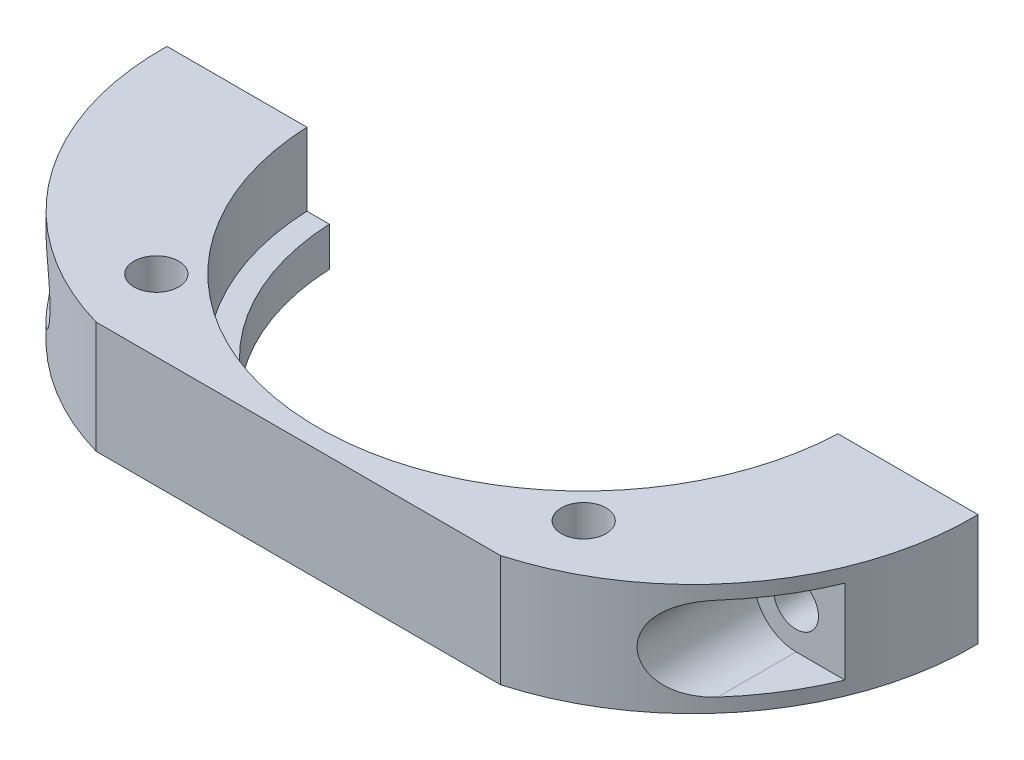
ISO-10303-21;
HEADER;
FILE_DESCRIPTION(('STEP AP214'),'2;1');
FILE_NAME('part.step','',(''),(''),'','','');
FILE_SCHEMA(('AUTOMOTIVE_DESIGN { 1 0 10303 214 1 1 1 1 }'));
ENDSEC;
DATA;
#1=APPLICATION_CONTEXT('core data for automotive mechanical design processes');
#2=APPLICATION_PROTOCOL_DEFINITION('international standard','automotive_design',2000,#1);
#3=PRODUCT_CONTEXT('',#1,'mechanical');
#4=PRODUCT('Part','Part','',(#3));
#5=PRODUCT_RELATED_PRODUCT_CATEGORY('part','',(#4));
#6=PRODUCT_DEFINITION_FORMATION('','',#4);
#7=PRODUCT_DEFINITION_CONTEXT('part definition',#1,'design');
#8=PRODUCT_DEFINITION('design','',#6,#7);
#9=PRODUCT_DEFINITION_SHAPE('','',#8);
#10=(LENGTH_UNIT() NAMED_UNIT(*) SI_UNIT(.MILLI.,.METRE.));
#11=(NAMED_UNIT(*) PLANE_ANGLE_UNIT() SI_UNIT($,.RADIAN.));
#12=(NAMED_UNIT(*) SI_UNIT($,.STERADIAN.) SOLID_ANGLE_UNIT());
#13=UNCERTAINTY_MEASURE_WITH_UNIT(LENGTH_MEASURE(1.E-05),#10,'distance_accuracy_value','');
#14=(GEOMETRIC_REPRESENTATION_CONTEXT(3) GLOBAL_UNCERTAINTY_ASSIGNED_CONTEXT((#13)) GLOBAL_UNIT_ASSIGNED_CONTEXT((#10,
#11,#12)) REPRESENTATION_CONTEXT('',''));
#15=CARTESIAN_POINT('',(0.,0.,0.));
#16=DIRECTION('',(0.,0.,1.));
#17=DIRECTION('',(1.,0.,0.));
#18=AXIS2_PLACEMENT_3D('',#15,#16,#17);
#19=CARTESIAN_POINT('',(22.4760908283651,0.,2.89990936322075));
#20=DIRECTION('',(0.,1.,0.));
#21=DIRECTION('',(0.,0.,1.));
#22=AXIS2_PLACEMENT_3D('',#19,#20,#21);
#23=CYLINDRICAL_SURFACE('',#22,50.);
#24=CARTESIAN_POINT('',(22.4760908283651,20.,2.89990936322075));
#25=DIRECTION('',(0.,1.,0.));
#26=DIRECTION('',(0.,0.,1.));
#27=AXIS2_PLACEMENT_3D('',#24,#25,#26);
#28=CIRCLE('',#27,50.);
#29=CARTESIAN_POINT('',(36.1282437990003,20.,51.));
#30=VERTEX_POINT('',#29);
#31=CARTESIAN_POINT('',(72.467991803803,20.,1.99999999999999));
#32=VERTEX_POINT('',#31);
#33=EDGE_CURVE('E191',#30,#32,#28,.T.);
#34=ORIENTED_EDGE('',*,*,#33,.F.);
#35=DIRECTION('',(0.,1.,0.));
#36=VECTOR('',#35,1.);
#37=CARTESIAN_POINT('',(36.1282437990003,0.,51.));
#38=LINE('',#37,#36);
#39=CARTESIAN_POINT('',(36.1282437990003,0.,51.));
#40=VERTEX_POINT('',#39);
#41=EDGE_CURVE('E220',#40,#30,#38,.T.);
#42=ORIENTED_EDGE('',*,*,#41,.F.);
#43=CARTESIAN_POINT('',(22.4760908283651,0.,2.89990936322075));
#44=DIRECTION('',(0.,1.,0.));
#45=DIRECTION('',(0.,0.,1.));
#46=AXIS2_PLACEMENT_3D('',#43,#44,#45);
#47=CIRCLE('',#46,50.);
#48=CARTESIAN_POINT('',(72.467991803803,0.,1.99999999999999));
#49=VERTEX_POINT('',#48);
#50=EDGE_CURVE('E192',#40,#49,#47,.T.);
#51=ORIENTED_EDGE('',*,*,#50,.T.);
#52=DIRECTION('',(0.,1.,0.));
#53=VECTOR('',#52,1.);
#54=CARTESIAN_POINT('',(72.467991803803,0.,1.99999999999999));
#55=LINE('',#54,#53);
#56=EDGE_CURVE('E195',#49,#32,#55,.T.);
#57=ORIENTED_EDGE('',*,*,#56,.T.);
#58=EDGE_LOOP('',(#34,#42,#51,#57));
#59=FACE_BOUND('',#58,.T.);
#60=CARTESIAN_POINT('',(59.9629339312361,2.5,35.9867132913843));
#61=CARTESIAN_POINT('',(59.8321473534697,2.50000490254947,36.1348939411293));
#62=CARTESIAN_POINT('',(59.7004895048435,2.50342124204607,36.2822872340539));
#63=CARTESIAN_POINT('',(59.4355872395805,2.51738552209846,36.5753402070957));
#64=CARTESIAN_POINT('',(59.3023425709022,2.52793461083026,36.7209996042615));
#65=CARTESIAN_POINT('',(58.899885127785,2.57081094263651,37.1557596064065));
#66=CARTESIAN_POINT('',(58.6285765048718,2.61437026344922,37.4419310998493));
#67=CARTESIAN_POINT('',(58.0796973690396,2.73479019147125,38.00746228713));
#68=CARTESIAN_POINT('',(57.8020907417195,2.81202116393458,38.2867086213446));
#69=CARTESIAN_POINT('',(57.2470365893541,3.00286684903563,38.8322394316276));
#70=CARTESIAN_POINT('',(56.9695892700129,3.11643801618865,39.0985389837632));
#71=CARTESIAN_POINT('',(56.5189695744482,3.33463671248979,39.5214936845249));
#72=CARTESIAN_POINT('',(56.3444985051512,3.42755004567878,39.6828647604816));
#73=CARTESIAN_POINT('',(55.9987140296877,3.63014188382216,39.9982706653034));
#74=CARTESIAN_POINT('',(55.8273997577188,3.7398157128781,40.152307524621));
#75=CARTESIAN_POINT('',(55.4902010938871,3.97614017743429,40.4514625392735));
#76=CARTESIAN_POINT('',(55.3242983178517,4.10272374662969,40.5966127830976));
#77=CARTESIAN_POINT('',(54.9991493215393,4.37366892460497,40.8774920901841));
#78=CARTESIAN_POINT('',(54.8399019093066,4.51802733153071,41.0132228433502));
#79=CARTESIAN_POINT('',(54.5570235026142,4.79820980865781,41.2514650263187));
#80=CARTESIAN_POINT('',(54.431995476748,4.93119302066629,41.3556621762076));
#81=CARTESIAN_POINT('',(54.1893519559021,5.20940446918353,41.5560060249135));
#82=CARTESIAN_POINT('',(54.0717349613603,5.35463021452137,41.6521543536462));
#83=CARTESIAN_POINT('',(53.8452443331133,5.65723341596586,41.8357217472647));
#84=CARTESIAN_POINT('',(53.7363791925658,5.81462239213998,41.9231323522569));
#85=CARTESIAN_POINT('',(53.5291031290041,6.14083672774188,42.0882747755026));
#86=CARTESIAN_POINT('',(53.4306868597078,6.3096561655197,42.1660115470201));
#87=CARTESIAN_POINT('',(53.2450246747228,6.6594576969593,42.3116684910022));
#88=CARTESIAN_POINT('',(53.1578787088994,6.84052944376635,42.3795014348266));
#89=CARTESIAN_POINT('',(52.9972738663002,7.21242082745399,42.5037943949642));
#90=CARTESIAN_POINT('',(52.923815350952,7.40324072157237,42.5602541109618));
#91=CARTESIAN_POINT('',(52.7920670926956,7.79297801495934,42.6610520522234));
#92=CARTESIAN_POINT('',(52.7337651301242,7.99188874057879,42.7054000437868));
#93=CARTESIAN_POINT('',(52.6334760068504,8.39613287146042,42.781435115773));
#94=CARTESIAN_POINT('',(52.5914859769669,8.60146514033613,42.813124422818));
#95=CARTESIAN_POINT('',(52.5294636995233,8.98704608161373,42.8598399435531));
#96=CARTESIAN_POINT('',(52.5071629541487,9.16672561934126,42.8765911790697));
#97=CARTESIAN_POINT('',(52.4756158370107,9.52786677814178,42.9002705516381));
#98=CARTESIAN_POINT('',(52.4663683686512,9.70932824822612,42.907199513852));
#99=CARTESIAN_POINT('',(52.4610865284788,10.072477977827,42.9111583128527));
#100=CARTESIAN_POINT('',(52.4650470186662,10.2541661216773,42.9081919989795));
#101=CARTESIAN_POINT('',(52.4861019172273,10.6163469857034,42.8924012577202));
#102=CARTESIAN_POINT('',(52.5031960585452,10.7968397301107,42.8795770307819));
#103=CARTESIAN_POINT('',(52.5486337050359,11.1430414161387,42.845408587638));
#104=CARTESIAN_POINT('',(52.5761380065553,11.3089244866859,42.8246994031264));
#105=CARTESIAN_POINT('',(52.6419236384752,11.6373335251483,42.7750172508248));
#106=CARTESIAN_POINT('',(52.6802083679218,11.7998584168606,42.7460416766216));
#107=CARTESIAN_POINT('',(52.767005056981,12.1204178085625,42.6800989021646));
#108=CARTESIAN_POINT('',(52.8155130901551,12.2784540061462,42.643134769918));
#109=CARTESIAN_POINT('',(52.9221436225707,12.5892625404786,42.561507627507));
#110=CARTESIAN_POINT('',(52.9802697583256,12.7420328597493,42.5168417050989));
#111=CARTESIAN_POINT('',(53.107879911177,13.0474054165437,42.4182626034981));
#112=CARTESIAN_POINT('',(53.1777217955468,13.1997627955091,42.3640539133711));
#113=CARTESIAN_POINT('',(53.3261368588886,13.4972267405823,42.2481436553853));
#114=CARTESIAN_POINT('',(53.4047131875408,13.6423306635383,42.1864393838366));
#115=CARTESIAN_POINT('',(53.6521800421304,14.0658487983618,41.9907723308823));
#116=CARTESIAN_POINT('',(53.8328799312477,14.3326372486403,41.8462005997349));
#117=CARTESIAN_POINT('',(54.2428500461209,14.8638780945627,41.5127479477496));
#118=CARTESIAN_POINT('',(54.4753754343577,15.1236971540149,41.3205679571745));
#119=CARTESIAN_POINT('',(54.9615864708278,15.599308575329,40.910351221334));
#120=CARTESIAN_POINT('',(55.2152814304039,15.8150814183206,40.6923030801047));
#121=CARTESIAN_POINT('',(55.6748357611345,16.1582613655552,40.2885974641109));
#122=CARTESIAN_POINT('',(55.8780148509836,16.2945343008477,40.1072828090559));
#123=CARTESIAN_POINT('',(56.2892947720284,16.5430968685945,39.7339201051077));
#124=CARTESIAN_POINT('',(56.4973978062551,16.6553755314145,39.5418671973355));
#125=CARTESIAN_POINT('',(56.9166665989566,16.8574486146319,39.1480785126815));
#126=CARTESIAN_POINT('',(57.1278400314058,16.9471698789752,38.9463136965674));
#127=CARTESIAN_POINT('',(57.5506091481987,17.1050398109545,38.5350760041181));
#128=CARTESIAN_POINT('',(57.7622047383846,17.1731928430402,38.3256046968223));
#129=CARTESIAN_POINT('',(58.1427298284313,17.277895382665,37.94201027419));
#130=CARTESIAN_POINT('',(58.3118599633097,17.3180249867996,37.7690445564211));
#131=CARTESIAN_POINT('',(58.6487629873141,17.3859650367671,37.4194215298302));
#132=CARTESIAN_POINT('',(58.8165358998936,17.4137756959245,37.2427642849891));
#133=CARTESIAN_POINT('',(59.1487935136578,17.4575487478707,36.8877229525871));
#134=CARTESIAN_POINT('',(59.3132939342071,17.4736072311476,36.7093652311282));
#135=CARTESIAN_POINT('',(59.6399586776628,17.494826875342,36.3499620975961));
#136=CARTESIAN_POINT('',(59.8021235934731,17.4999908522164,36.1689173922275));
#137=CARTESIAN_POINT('',(59.9629339312361,17.5,35.9867132913843));
#138=B_SPLINE_CURVE_WITH_KNOTS('',3,(#60,#61,#62,#63,#64,#65,#66,#67,#68,#69,#70,#71,#72,#73,
#74,#75,#76,#77,#78,#79,#80,#81,#82,#83,#84,#85,#86,#87,#88,#89,#90,#91,#92,#93,#94,#95,#96,#97,
#98,#99,#100,#101,#102,#103,#104,#105,#106,#107,#108,#109,#110,#111,#112,#113,#114,#115,#116,
#117,#118,#119,#120,#121,#122,#123,#124,#125,#126,#127,#128,#129,#130,#131,#132,#133,#134,#135,
#136,#137),.UNSPECIFIED.,.F.,.F.,(4,2,2,2,2,2,2,2,2,2,2,2,2,2,2,2,2,2,2,2,2,2,2,2,2,2,2,2,2,2,2,
2,2,2,2,2,2,2,4),(0.,0.592861417796266,1.18581829266591,2.37456931277627,3.57673934488402,
4.77747420966356,5.54241456580662,6.30714190464041,7.06892161217391,7.83056429741832,
8.46050174486658,9.09031131752983,9.7207248849041,10.3508143236371,10.9861559400371,
11.6215143307411,12.2563588767809,12.8910917064714,13.4358706974822,13.9806039192932,
14.5251252603258,15.0696355295154,15.5773115874443,16.0851478941373,16.5927895117004,
17.1006235041632,17.6285111051843,18.1565896862099,19.212181270664,20.4023384207536,
21.5930218437949,22.5053797299361,23.4181538371748,24.3338510538087,25.2493628554512,
25.9846815708407,26.7199875523706,27.4492120771395,28.1782480925518),.UNSPECIFIED.);
#139=CARTESIAN_POINT('',(59.9629339312361,2.5,35.9867132913843));
#140=VERTEX_POINT('',#139);
#141=CARTESIAN_POINT('',(59.9629339312361,17.5,35.9867132913843));
#142=VERTEX_POINT('',#141);
#143=EDGE_CURVE('E46',#140,#142,#138,.T.);
#144=ORIENTED_EDGE('',*,*,#143,.T.);
#145=CARTESIAN_POINT('',(22.4760908283651,17.5,2.89990936322075));
#146=DIRECTION('',(0.,-1.,0.));
#147=DIRECTION('',(0.,0.,-1.));
#148=AXIS2_PLACEMENT_3D('',#145,#146,#147);
#149=CIRCLE('',#148,50.);
#150=CARTESIAN_POINT('',(68.6841695340072,17.5,22.));
#151=VERTEX_POINT('',#150);
#152=EDGE_CURVE('E11',#142,#151,#149,.F.);
#153=ORIENTED_EDGE('',*,*,#152,.T.);
#154=DIRECTION('',(0.,1.,0.));
#155=VECTOR('',#154,1.);
#156=CARTESIAN_POINT('',(68.6841695340072,0.,22.));
#157=LINE('',#156,#155);
#158=CARTESIAN_POINT('',(68.6841695340072,2.5,22.));
#159=VERTEX_POINT('',#158);
#160=EDGE_CURVE('E165',#159,#151,#157,.T.);
#161=ORIENTED_EDGE('',*,*,#160,.F.);
#162=CARTESIAN_POINT('',(22.4760908283651,2.5,2.89990936322075));
#163=DIRECTION('',(0.,-1.,0.));
#164=DIRECTION('',(0.,0.,-1.));
#165=AXIS2_PLACEMENT_3D('',#162,#163,#164);
#166=CIRCLE('',#165,50.);
#167=EDGE_CURVE('E152',#140,#159,#166,.F.);
#168=ORIENTED_EDGE('',*,*,#167,.F.);
#169=EDGE_LOOP('',(#144,#153,#161,#168));
#170=FACE_BOUND('',#169,.T.);
#171=ADVANCED_FACE('F38',(#59,#170),#23,.T.);
#172=CARTESIAN_POINT('',(-22.4760908283651,0.,2.89990936322075));
#173=DIRECTION('',(0.,1.,0.));
#174=DIRECTION('',(0.,0.,1.));
#175=AXIS2_PLACEMENT_3D('',#172,#173,#174);
#176=CYLINDRICAL_SURFACE('',#175,50.);
#177=CARTESIAN_POINT('',(-22.4760908283651,20.,2.89990936322075));
#178=DIRECTION('',(0.,1.,0.));
#179=DIRECTION('',(0.,0.,1.));
#180=AXIS2_PLACEMENT_3D('',#177,#178,#179);
#181=CIRCLE('',#180,50.);
#182=CARTESIAN_POINT('',(-36.1282437990003,20.,51.));
#183=VERTEX_POINT('',#182);
#184=CARTESIAN_POINT('',(-72.467991803803,20.,2.));
#185=VERTEX_POINT('',#184);
#186=EDGE_CURVE('E200',#183,#185,#181,.F.);
#187=ORIENTED_EDGE('',*,*,#186,.T.);
#188=DIRECTION('',(0.,1.,0.));
#189=VECTOR('',#188,1.);
#190=CARTESIAN_POINT('',(-72.467991803803,0.,2.));
#191=LINE('',#190,#189);
#192=CARTESIAN_POINT('',(-72.467991803803,0.,2.));
#193=VERTEX_POINT('',#192);
#194=EDGE_CURVE('E204',#193,#185,#191,.T.);
#195=ORIENTED_EDGE('',*,*,#194,.F.);
#196=CARTESIAN_POINT('',(-22.4760908283651,0.,2.89990936322075));
#197=DIRECTION('',(0.,1.,0.));
#198=DIRECTION('',(0.,0.,1.));
#199=AXIS2_PLACEMENT_3D('',#196,#197,#198);
#200=CIRCLE('',#199,50.);
#201=CARTESIAN_POINT('',(-36.1282437990003,0.,51.));
#202=VERTEX_POINT('',#201);
#203=EDGE_CURVE('E201',#202,#193,#200,.F.);
#204=ORIENTED_EDGE('',*,*,#203,.F.);
#205=DIRECTION('',(0.,1.,0.));
#206=VECTOR('',#205,1.);
#207=CARTESIAN_POINT('',(-36.1282437990003,0.,51.));
#208=LINE('',#207,#206);
#209=EDGE_CURVE('E216',#202,#183,#208,.T.);
#210=ORIENTED_EDGE('',*,*,#209,.T.);
#211=EDGE_LOOP('',(#187,#195,#204,#210));
#212=FACE_BOUND('',#211,.T.);
#213=CARTESIAN_POINT('',(-22.4760908283651,2.5,2.89990936322075));
#214=DIRECTION('',(0.,1.,0.));
#215=DIRECTION('',(0.,0.,1.));
#216=AXIS2_PLACEMENT_3D('',#213,#214,#215);
#217=CIRCLE('',#216,50.);
#218=CARTESIAN_POINT('',(-68.6841695340072,2.5,22.));
#219=VERTEX_POINT('',#218);
#220=CARTESIAN_POINT('',(-59.9629339312361,2.5,35.9867132913843));
#221=VERTEX_POINT('',#220);
#222=EDGE_CURVE('E275',#219,#221,#217,.T.);
#223=ORIENTED_EDGE('',*,*,#222,.F.);
#224=DIRECTION('',(0.,1.,0.));
#225=VECTOR('',#224,1.);
#226=CARTESIAN_POINT('',(-68.6841695340072,0.,22.));
#227=LINE('',#226,#225);
#228=CARTESIAN_POINT('',(-68.6841695340072,17.5,22.));
#229=VERTEX_POINT('',#228);
#230=EDGE_CURVE('E181',#219,#229,#227,.T.);
#231=ORIENTED_EDGE('',*,*,#230,.T.);
#232=CARTESIAN_POINT('',(-22.4760908283651,17.5,2.89990936322075));
#233=DIRECTION('',(0.,1.,0.));
#234=DIRECTION('',(0.,0.,1.));
#235=AXIS2_PLACEMENT_3D('',#232,#233,#234);
#236=CIRCLE('',#235,50.);
#237=CARTESIAN_POINT('',(-59.9629339312361,17.5,35.9867132913843));
#238=VERTEX_POINT('',#237);
#239=EDGE_CURVE('E263',#229,#238,#236,.T.);
#240=ORIENTED_EDGE('',*,*,#239,.T.);
#241=CARTESIAN_POINT('',(-59.9629339312361,17.5,35.9867132913843));
#242=CARTESIAN_POINT('',(-59.8321473534697,17.4999950974505,36.1348939411293));
#243=CARTESIAN_POINT('',(-59.7004895048435,17.4965787579539,36.2822872340539));
#244=CARTESIAN_POINT('',(-59.4355872395805,17.4826144779015,36.5753402070957));
#245=CARTESIAN_POINT('',(-59.3023425709022,17.4720653891697,36.7209996042615));
#246=CARTESIAN_POINT('',(-58.899885127785,17.4291890573635,37.1557596064065));
#247=CARTESIAN_POINT('',(-58.6285765048718,17.3856297365508,37.4419310998493));
#248=CARTESIAN_POINT('',(-58.0796973690396,17.2652098085287,38.00746228713));
#249=CARTESIAN_POINT('',(-57.8020907417195,17.1879788360654,38.2867086213447));
#250=CARTESIAN_POINT('',(-57.2470365893541,16.9971331509644,38.8322394316276));
#251=CARTESIAN_POINT('',(-56.9695892700129,16.8835619838113,39.0985389837632));
#252=CARTESIAN_POINT('',(-56.5189695744482,16.6653632875102,39.5214936845249));
#253=CARTESIAN_POINT('',(-56.3444985051512,16.5724499543212,39.6828647604816));
#254=CARTESIAN_POINT('',(-55.9987140296877,16.3698581161778,39.9982706653035));
#255=CARTESIAN_POINT('',(-55.8273997577188,16.2601842871219,40.1523075246211));
#256=CARTESIAN_POINT('',(-55.4902010938871,16.0238598225657,40.4514625392735));
#257=CARTESIAN_POINT('',(-55.3242983178517,15.8972762533703,40.5966127830976));
#258=CARTESIAN_POINT('',(-54.9991493215393,15.626331075395,40.8774920901842));
#259=CARTESIAN_POINT('',(-54.8399019093066,15.4819726684693,41.0132228433502));
#260=CARTESIAN_POINT('',(-54.5570235026142,15.2017901913422,41.2514650263187));
#261=CARTESIAN_POINT('',(-54.431995476748,15.0688069793337,41.3556621762076));
#262=CARTESIAN_POINT('',(-54.189351955902,14.7905955308165,41.5560060249135));
#263=CARTESIAN_POINT('',(-54.0717349613603,14.6453697854786,41.6521543536462));
#264=CARTESIAN_POINT('',(-53.8452443331133,14.3427665840341,41.8357217472648));
#265=CARTESIAN_POINT('',(-53.7363791925658,14.18537760786,41.9231323522569));
#266=CARTESIAN_POINT('',(-53.5291031290041,13.8591632722581,42.0882747755026));
#267=CARTESIAN_POINT('',(-53.4306868597078,13.6903438344803,42.1660115470201));
#268=CARTESIAN_POINT('',(-53.2450246747228,13.3405423030407,42.3116684910022));
#269=CARTESIAN_POINT('',(-53.1578787088994,13.1594705562336,42.3795014348266));
#270=CARTESIAN_POINT('',(-52.9972738663002,12.787579172546,42.5037943949643));
#271=CARTESIAN_POINT('',(-52.923815350952,12.5967592784276,42.5602541109619));
#272=CARTESIAN_POINT('',(-52.7920670926956,12.2070219850407,42.6610520522234));
#273=CARTESIAN_POINT('',(-52.7337651301242,12.0081112594212,42.7054000437868));
#274=CARTESIAN_POINT('',(-52.6334760068504,11.6038671285396,42.781435115773));
#275=CARTESIAN_POINT('',(-52.5914859769669,11.3985348596639,42.8131244228181));
#276=CARTESIAN_POINT('',(-52.5294636995233,11.0129539183863,42.8598399435532));
#277=CARTESIAN_POINT('',(-52.5071629541487,10.8332743806587,42.8765911790697));
#278=CARTESIAN_POINT('',(-52.4756158370107,10.4721332218582,42.9002705516381));
#279=CARTESIAN_POINT('',(-52.4663683686512,10.2906717517739,42.907199513852));
#280=CARTESIAN_POINT('',(-52.4610865284788,9.927522022173,42.9111583128527));
#281=CARTESIAN_POINT('',(-52.4650470186662,9.74583387832267,42.9081919989795));
#282=CARTESIAN_POINT('',(-52.4861019172273,9.38365301429663,42.8924012577202));
#283=CARTESIAN_POINT('',(-52.5031960585452,9.20316026988929,42.8795770307819));
#284=CARTESIAN_POINT('',(-52.5486337050359,8.85695858386134,42.845408587638));
#285=CARTESIAN_POINT('',(-52.5761380065553,8.69107551331411,42.8246994031264));
#286=CARTESIAN_POINT('',(-52.6419236384752,8.36266647485174,42.7750172508248));
#287=CARTESIAN_POINT('',(-52.6802083679218,8.20014158313936,42.7460416766216));
#288=CARTESIAN_POINT('',(-52.767005056981,7.87958219143747,42.6800989021646));
#289=CARTESIAN_POINT('',(-52.8155130901552,7.72154599385384,42.643134769918));
#290=CARTESIAN_POINT('',(-52.9221436225707,7.41073745952139,42.561507627507));
#291=CARTESIAN_POINT('',(-52.9802697583256,7.25796714025071,42.516841705099));
#292=CARTESIAN_POINT('',(-53.107879911177,6.95259458345632,42.4182626034981));
#293=CARTESIAN_POINT('',(-53.1777217955468,6.80023720449095,42.3640539133711));
#294=CARTESIAN_POINT('',(-53.3261368588886,6.50277325941769,42.2481436553853));
#295=CARTESIAN_POINT('',(-53.4047131875408,6.3576693364617,42.1864393838366));
#296=CARTESIAN_POINT('',(-53.6521800421304,5.93415120163822,41.9907723308823));
#297=CARTESIAN_POINT('',(-53.8328799312477,5.66736275135969,41.8462005997349));
#298=CARTESIAN_POINT('',(-54.2428500461209,5.13612190543732,41.5127479477496));
#299=CARTESIAN_POINT('',(-54.4753754343577,4.8763028459851,41.3205679571745));
#300=CARTESIAN_POINT('',(-54.9615864708278,4.40069142467101,40.9103512213341));
#301=CARTESIAN_POINT('',(-55.2152814304039,4.18491858167938,40.6923030801047));
#302=CARTESIAN_POINT('',(-55.6748357611345,3.84173863444482,40.2885974641109));
#303=CARTESIAN_POINT('',(-55.8780148509836,3.70546569915233,40.1072828090559));
#304=CARTESIAN_POINT('',(-56.2892947720284,3.45690313140551,39.7339201051077));
#305=CARTESIAN_POINT('',(-56.4973978062551,3.34462446858548,39.5418671973355));
#306=CARTESIAN_POINT('',(-56.9166665989566,3.14255138536811,39.1480785126815));
#307=CARTESIAN_POINT('',(-57.1278400314057,3.05283012102484,38.9463136965674));
#308=CARTESIAN_POINT('',(-57.5506091481986,2.8949601890455,38.5350760041182));
#309=CARTESIAN_POINT('',(-57.7622047383846,2.82680715695984,38.3256046968223));
#310=CARTESIAN_POINT('',(-58.1427298284313,2.72210461733496,37.94201027419));
#311=CARTESIAN_POINT('',(-58.3118599633097,2.68197501320036,37.7690445564211));
#312=CARTESIAN_POINT('',(-58.6487629873141,2.61403496323295,37.4194215298303));
#313=CARTESIAN_POINT('',(-58.8165358998936,2.58622430407552,37.2427642849891));
#314=CARTESIAN_POINT('',(-59.1487935136578,2.54245125212925,36.8877229525871));
#315=CARTESIAN_POINT('',(-59.3132939342071,2.52639276885243,36.7093652311282));
#316=CARTESIAN_POINT('',(-59.6399586776628,2.50517312465795,36.3499620975961));
#317=CARTESIAN_POINT('',(-59.8021235934731,2.50000914778359,36.1689173922275));
#318=CARTESIAN_POINT('',(-59.9629339312361,2.5,35.9867132913843));
#319=B_SPLINE_CURVE_WITH_KNOTS('',3,(#241,#242,#243,#244,#245,#246,#247,#248,#249,#250,#251,
#252,#253,#254,#255,#256,#257,#258,#259,#260,#261,#262,#263,#264,#265,#266,#267,#268,#269,#270,
#271,#272,#273,#274,#275,#276,#277,#278,#279,#280,#281,#282,#283,#284,#285,#286,#287,#288,#289,
#290,#291,#292,#293,#294,#295,#296,#297,#298,#299,#300,#301,#302,#303,#304,#305,#306,#307,#308,
#309,#310,#311,#312,#313,#314,#315,#316,#317,#318),.UNSPECIFIED.,.F.,.F.,(4,2,2,2,2,2,2,2,2,2,2,
2,2,2,2,2,2,2,2,2,2,2,2,2,2,2,2,2,2,2,2,2,2,2,2,2,2,2,4),(0.,0.592861417796261,1.18581829266591,
2.37456931277628,3.57673934488403,4.77747420966357,5.54241456580664,6.30714190464043,
7.06892161217394,7.83056429741834,8.4605017448666,9.09031131752986,9.72072488490412,
10.3508143236371,10.9861559400371,11.6215143307411,12.2563588767809,12.8910917064714,
13.4358706974822,13.9806039192932,14.5251252603258,15.0696355295154,15.5773115874443,
16.0851478941373,16.5927895117004,17.1006235041632,17.6285111051843,18.15658968621,
19.212181270664,20.4023384207536,21.5930218437949,22.5053797299361,23.4181538371748,
24.3338510538087,25.2493628554512,25.9846815708407,26.7199875523706,27.4492120771395,
28.1782480925519),.UNSPECIFIED.);
#320=EDGE_CURVE('E266',#238,#221,#319,.T.);
#321=ORIENTED_EDGE('',*,*,#320,.T.);
#322=EDGE_LOOP('',(#223,#231,#240,#321));
#323=FACE_BOUND('',#322,.T.);
#324=ADVANCED_FACE('F277',(#212,#323),#176,.T.);
#325=CARTESIAN_POINT('',(0.,20.,0.));
#326=DIRECTION('',(0.,-1.,0.));
#327=DIRECTION('',(0.,0.,-1.));
#328=AXIS2_PLACEMENT_3D('',#325,#326,#327);
#329=CYLINDRICAL_SURFACE('',#328,43.5);
#330=DIRECTION('',(0.,-1.,0.));
#331=VECTOR('',#330,1.);
#332=CARTESIAN_POINT('',(-43.4539986652552,20.,2.));
#333=LINE('',#332,#331);
#334=CARTESIAN_POINT('',(-43.4539986652552,7.,2.));
#335=VERTEX_POINT('',#334);
#336=CARTESIAN_POINT('',(-43.4539986652552,0.,2.));
#337=VERTEX_POINT('',#336);
#338=EDGE_CURVE('E234',#335,#337,#333,.T.);
#339=ORIENTED_EDGE('',*,*,#338,.F.);
#340=CARTESIAN_POINT('',(0.,7.,0.));
#341=DIRECTION('',(0.,1.,0.));
#342=DIRECTION('',(0.,0.,1.));
#343=AXIS2_PLACEMENT_3D('',#340,#341,#342);
#344=CIRCLE('',#343,43.5);
#345=CARTESIAN_POINT('',(43.4539986652552,7.,1.99999999999999));
#346=VERTEX_POINT('',#345);
#347=EDGE_CURVE('E252',#335,#346,#344,.T.);
#348=ORIENTED_EDGE('',*,*,#347,.T.);
#349=DIRECTION('',(0.,-1.,0.));
#350=VECTOR('',#349,1.);
#351=CARTESIAN_POINT('',(43.4539986652552,20.,1.99999999999999));
#352=LINE('',#351,#350);
#353=CARTESIAN_POINT('',(43.4539986652552,0.,1.99999999999999));
#354=VERTEX_POINT('',#353);
#355=EDGE_CURVE('E229',#354,#346,#352,.F.);
#356=ORIENTED_EDGE('',*,*,#355,.F.);
#357=CARTESIAN_POINT('',(0.,0.,0.));
#358=DIRECTION('',(0.,1.,0.));
#359=DIRECTION('',(0.,0.,1.));
#360=AXIS2_PLACEMENT_3D('',#357,#358,#359);
#361=CIRCLE('',#360,43.5);
#362=EDGE_CURVE('E255',#337,#354,#361,.T.);
#363=ORIENTED_EDGE('',*,*,#362,.F.);
#364=EDGE_LOOP('',(#339,#348,#356,#363));
#365=FACE_BOUND('',#364,.T.);
#366=ADVANCED_FACE('F464',(#365),#329,.F.);
#367=CARTESIAN_POINT('',(0.,20.,0.));
#368=DIRECTION('',(0.,1.,0.));
#369=DIRECTION('',(0.,0.,1.));
#370=AXIS2_PLACEMENT_3D('',#367,#368,#369);
#371=PLANE('',#370);
#372=DIRECTION('',(1.,0.,0.));
#373=VECTOR('',#372,1.);
#374=CARTESIAN_POINT('',(-75.,20.,2.));
#375=LINE('',#374,#373);
#376=CARTESIAN_POINT('',(-47.4578760586691,20.,2.));
#377=VERTEX_POINT('',#376);
#378=EDGE_CURVE('E213',#185,#377,#375,.T.);
#379=ORIENTED_EDGE('',*,*,#378,.F.);
#380=ORIENTED_EDGE('',*,*,#186,.F.);
#381=DIRECTION('',(-1.,0.,0.));
#382=VECTOR('',#381,1.);
#383=CARTESIAN_POINT('',(-36.1282437990003,20.,51.));
#384=LINE('',#383,#382);
#385=EDGE_CURVE('E209',#30,#183,#384,.T.);
#386=ORIENTED_EDGE('',*,*,#385,.F.);
#387=ORIENTED_EDGE('',*,*,#33,.T.);
#388=CARTESIAN_POINT('',(47.4578760586691,20.,1.99999999999999));
#389=VERTEX_POINT('',#388);
#390=EDGE_CURVE('E214',#389,#32,#375,.T.);
#391=ORIENTED_EDGE('',*,*,#390,.F.);
#392=CARTESIAN_POINT('',(0.,20.,0.));
#393=DIRECTION('',(0.,1.,0.));
#394=DIRECTION('',(0.,0.,1.));
#395=AXIS2_PLACEMENT_3D('',#392,#393,#394);
#396=CIRCLE('',#395,47.5);
#397=EDGE_CURVE('E240',#377,#389,#396,.T.);
#398=ORIENTED_EDGE('',*,*,#397,.F.);
#399=EDGE_LOOP('',(#379,#380,#386,#387,#391,#398));
#400=FACE_BOUND('',#399,.T.);
#401=CARTESIAN_POINT('',(-38.1837661840735,20.,38.1837661840736));
#402=DIRECTION('',(0.,1.,0.));
#403=DIRECTION('',(0.,0.,1.));
#404=AXIS2_PLACEMENT_3D('',#401,#402,#403);
#405=CIRCLE('',#404,4.00000000000001);
#406=CARTESIAN_POINT('',(-38.1837661840735,20.,42.1837661840737));
#407=VERTEX_POINT('',#406);
#408=EDGE_CURVE('E236',#407,#407,#405,.T.);
#409=ORIENTED_EDGE('',*,*,#408,.F.);
#410=EDGE_LOOP('',(#409));
#411=FACE_BOUND('',#410,.T.);
#412=CARTESIAN_POINT('',(38.1837661840736,20.,38.1837661840735));
#413=DIRECTION('',(0.,1.,0.));
#414=DIRECTION('',(0.,0.,1.));
#415=AXIS2_PLACEMENT_3D('',#412,#413,#414);
#416=CIRCLE('',#415,4.00000000000001);
#417=CARTESIAN_POINT('',(38.1837661840736,20.,42.1837661840735));
#418=VERTEX_POINT('',#417);
#419=EDGE_CURVE('E241',#418,#418,#416,.T.);
#420=ORIENTED_EDGE('',*,*,#419,.F.);
#421=EDGE_LOOP('',(#420));
#422=FACE_BOUND('',#421,.T.);
#423=ADVANCED_FACE('F458',(#400,#411,#422),#371,.T.);
#424=CARTESIAN_POINT('',(0.,0.,0.));
#425=DIRECTION('',(0.,1.,0.));
#426=DIRECTION('',(0.,0.,1.));
#427=AXIS2_PLACEMENT_3D('',#424,#425,#426);
#428=PLANE('',#427);
#429=CARTESIAN_POINT('',(-38.1837661840735,0.,38.1837661840736));
#430=DIRECTION('',(0.,1.,0.));
#431=DIRECTION('',(0.,0.,1.));
#432=AXIS2_PLACEMENT_3D('',#429,#430,#431);
#433=CIRCLE('',#432,4.00000000000001);
#434=CARTESIAN_POINT('',(-38.1837661840735,0.,42.1837661840737));
#435=VERTEX_POINT('',#434);
#436=EDGE_CURVE('E244',#435,#435,#433,.T.);
#437=ORIENTED_EDGE('',*,*,#436,.T.);
#438=EDGE_LOOP('',(#437));
#439=FACE_BOUND('',#438,.T.);
#440=CARTESIAN_POINT('',(38.1837661840736,0.,38.1837661840735));
#441=DIRECTION('',(0.,1.,0.));
#442=DIRECTION('',(0.,0.,1.));
#443=AXIS2_PLACEMENT_3D('',#440,#441,#442);
#444=CIRCLE('',#443,4.00000000000001);
#445=CARTESIAN_POINT('',(38.1837661840736,0.,42.1837661840735));
#446=VERTEX_POINT('',#445);
#447=EDGE_CURVE('E237',#446,#446,#444,.T.);
#448=ORIENTED_EDGE('',*,*,#447,.T.);
#449=EDGE_LOOP('',(#448));
#450=FACE_BOUND('',#449,.T.);
#451=DIRECTION('',(-1.,0.,0.));
#452=VECTOR('',#451,1.);
#453=CARTESIAN_POINT('',(-36.1282437990003,0.,51.));
#454=LINE('',#453,#452);
#455=EDGE_CURVE('E217',#40,#202,#454,.T.);
#456=ORIENTED_EDGE('',*,*,#455,.T.);
#457=ORIENTED_EDGE('',*,*,#203,.T.);
#458=DIRECTION('',(1.,0.,0.));
#459=VECTOR('',#458,1.);
#460=CARTESIAN_POINT('',(-75.,0.,2.));
#461=LINE('',#460,#459);
#462=EDGE_CURVE('E212',#193,#337,#461,.T.);
#463=ORIENTED_EDGE('',*,*,#462,.T.);
#464=ORIENTED_EDGE('',*,*,#362,.T.);
#465=EDGE_CURVE('E210',#354,#49,#461,.T.);
#466=ORIENTED_EDGE('',*,*,#465,.T.);
#467=ORIENTED_EDGE('',*,*,#50,.F.);
#468=EDGE_LOOP('',(#456,#457,#463,#464,#466,#467));
#469=FACE_BOUND('',#468,.T.);
#470=ADVANCED_FACE('F40',(#439,#450,#469),#428,.F.);
#471=CARTESIAN_POINT('',(0.,7.,0.));
#472=DIRECTION('',(0.,1.,0.));
#473=DIRECTION('',(0.,0.,1.));
#474=AXIS2_PLACEMENT_3D('',#471,#472,#473);
#475=CYLINDRICAL_SURFACE('',#474,47.5);
#476=ORIENTED_EDGE('',*,*,#397,.T.);
#477=DIRECTION('',(0.,1.,0.));
#478=VECTOR('',#477,1.);
#479=CARTESIAN_POINT('',(47.4578760586691,7.,1.99999999999999));
#480=LINE('',#479,#478);
#481=CARTESIAN_POINT('',(47.4578760586691,7.,1.99999999999999));
#482=VERTEX_POINT('',#481);
#483=EDGE_CURVE('E226',#389,#482,#480,.F.);
#484=ORIENTED_EDGE('',*,*,#483,.T.);
#485=CARTESIAN_POINT('',(0.,7.,0.));
#486=DIRECTION('',(0.,1.,0.));
#487=DIRECTION('',(0.,0.,1.));
#488=AXIS2_PLACEMENT_3D('',#485,#486,#487);
#489=CIRCLE('',#488,47.5);
#490=CARTESIAN_POINT('',(-47.4578760586691,7.,2.));
#491=VERTEX_POINT('',#490);
#492=EDGE_CURVE('E249',#491,#482,#489,.T.);
#493=ORIENTED_EDGE('',*,*,#492,.F.);
#494=DIRECTION('',(0.,1.,0.));
#495=VECTOR('',#494,1.);
#496=CARTESIAN_POINT('',(-47.4578760586691,7.,2.));
#497=LINE('',#496,#495);
#498=EDGE_CURVE('E231',#491,#377,#497,.T.);
#499=ORIENTED_EDGE('',*,*,#498,.T.);
#500=EDGE_LOOP('',(#476,#484,#493,#499));
#501=FACE_BOUND('',#500,.T.);
#502=ADVANCED_FACE('F443',(#501),#475,.F.);
#503=CARTESIAN_POINT('',(0.,7.,0.));
#504=DIRECTION('',(0.,1.,0.));
#505=DIRECTION('',(0.,0.,1.));
#506=AXIS2_PLACEMENT_3D('',#503,#504,#505);
#507=PLANE('',#506);
#508=DIRECTION('',(1.,0.,0.));
#509=VECTOR('',#508,1.);
#510=CARTESIAN_POINT('',(0.,7.,1.99999999999999));
#511=LINE('',#510,#509);
#512=EDGE_CURVE('E262',#491,#335,#511,.T.);
#513=ORIENTED_EDGE('',*,*,#512,.F.);
#514=ORIENTED_EDGE('',*,*,#492,.T.);
#515=EDGE_CURVE('E258',#346,#482,#511,.T.);
#516=ORIENTED_EDGE('',*,*,#515,.F.);
#517=ORIENTED_EDGE('',*,*,#347,.F.);
#518=EDGE_LOOP('',(#513,#514,#516,#517));
#519=FACE_BOUND('',#518,.T.);
#520=ADVANCED_FACE('F435',(#519),#507,.T.);
#521=CARTESIAN_POINT('',(38.1837661840736,0.,38.1837661840735));
#522=DIRECTION('',(0.,1.,0.));
#523=DIRECTION('',(0.,0.,1.));
#524=AXIS2_PLACEMENT_3D('',#521,#522,#523);
#525=CYLINDRICAL_SURFACE('',#524,4.00000000000001);
#526=ORIENTED_EDGE('',*,*,#447,.F.);
#527=EDGE_LOOP('',(#526));
#528=FACE_BOUND('',#527,.T.);
#529=ORIENTED_EDGE('',*,*,#419,.T.);
#530=EDGE_LOOP('',(#529));
#531=FACE_BOUND('',#530,.T.);
#532=ADVANCED_FACE('F426',(#528,#531),#525,.F.);
#533=CARTESIAN_POINT('',(-38.1837661840735,0.,38.1837661840736));
#534=DIRECTION('',(0.,1.,0.));
#535=DIRECTION('',(0.,0.,1.));
#536=AXIS2_PLACEMENT_3D('',#533,#534,#535);
#537=CYLINDRICAL_SURFACE('',#536,4.00000000000001);
#538=ORIENTED_EDGE('',*,*,#436,.F.);
#539=EDGE_LOOP('',(#538));
#540=FACE_BOUND('',#539,.T.);
#541=ORIENTED_EDGE('',*,*,#408,.T.);
#542=EDGE_LOOP('',(#541));
#543=FACE_BOUND('',#542,.T.);
#544=ADVANCED_FACE('F419',(#540,#543),#537,.F.);
#545=CARTESIAN_POINT('',(-75.,0.,2.));
#546=DIRECTION('',(0.,0.,1.));
#547=DIRECTION('',(1.,0.,0.));
#548=AXIS2_PLACEMENT_3D('',#545,#546,#547);
#549=PLANE('',#548);
#550=CARTESIAN_POINT('',(59.9629339312361,10.,1.99999999999998));
#551=DIRECTION('',(0.,0.,-1.));
#552=DIRECTION('',(-1.,0.,0.));
#553=AXIS2_PLACEMENT_3D('',#550,#551,#552);
#554=CIRCLE('',#553,4.00000000000001);
#555=CARTESIAN_POINT('',(55.9629339312361,10.,1.99999999999998));
#556=VERTEX_POINT('',#555);
#557=EDGE_CURVE('E188',#556,#556,#554,.T.);
#558=ORIENTED_EDGE('',*,*,#557,.F.);
#559=EDGE_LOOP('',(#558));
#560=FACE_BOUND('',#559,.T.);
#561=ORIENTED_EDGE('',*,*,#465,.F.);
#562=ORIENTED_EDGE('',*,*,#355,.T.);
#563=ORIENTED_EDGE('',*,*,#515,.T.);
#564=ORIENTED_EDGE('',*,*,#483,.F.);
#565=ORIENTED_EDGE('',*,*,#390,.T.);
#566=ORIENTED_EDGE('',*,*,#56,.F.);
#567=EDGE_LOOP('',(#561,#562,#563,#564,#565,#566));
#568=FACE_BOUND('',#567,.T.);
#569=ADVANCED_FACE('F413',(#560,#568),#549,.F.);
#570=CARTESIAN_POINT('',(-59.9629339312361,10.,2.));
#571=DIRECTION('',(0.,0.,-1.));
#572=DIRECTION('',(-1.,0.,0.));
#573=AXIS2_PLACEMENT_3D('',#570,#571,#572);
#574=CIRCLE('',#573,4.00000000000001);
#575=CARTESIAN_POINT('',(-63.9629339312361,10.,2.));
#576=VERTEX_POINT('',#575);
#577=EDGE_CURVE('E185',#576,#576,#574,.T.);
#578=ORIENTED_EDGE('',*,*,#577,.F.);
#579=EDGE_LOOP('',(#578));
#580=FACE_BOUND('',#579,.T.);
#581=ORIENTED_EDGE('',*,*,#378,.T.);
#582=ORIENTED_EDGE('',*,*,#498,.F.);
#583=ORIENTED_EDGE('',*,*,#512,.T.);
#584=ORIENTED_EDGE('',*,*,#338,.T.);
#585=ORIENTED_EDGE('',*,*,#462,.F.);
#586=ORIENTED_EDGE('',*,*,#194,.T.);
#587=EDGE_LOOP('',(#581,#582,#583,#584,#585,#586));
#588=FACE_BOUND('',#587,.T.);
#589=ADVANCED_FACE('F403',(#580,#588),#549,.F.);
#590=CARTESIAN_POINT('',(-36.1282437990003,0.,51.));
#591=DIRECTION('',(0.,0.,-1.));
#592=DIRECTION('',(-1.,0.,0.));
#593=AXIS2_PLACEMENT_3D('',#590,#591,#592);
#594=PLANE('',#593);
#595=ORIENTED_EDGE('',*,*,#385,.T.);
#596=ORIENTED_EDGE('',*,*,#209,.F.);
#597=ORIENTED_EDGE('',*,*,#455,.F.);
#598=ORIENTED_EDGE('',*,*,#41,.T.);
#599=EDGE_LOOP('',(#595,#596,#597,#598));
#600=FACE_BOUND('',#599,.T.);
#601=ADVANCED_FACE('F300',(#600),#594,.F.);
#602=CARTESIAN_POINT('',(59.9629339312361,10.,51.));
#603=DIRECTION('',(0.,0.,-1.));
#604=DIRECTION('',(-1.,0.,0.));
#605=AXIS2_PLACEMENT_3D('',#602,#603,#604);
#606=CYLINDRICAL_SURFACE('',#605,4.00000000000001);
#607=CARTESIAN_POINT('',(59.9629339312361,10.,22.));
#608=DIRECTION('',(0.,0.,1.));
#609=DIRECTION('',(1.,0.,0.));
#610=AXIS2_PLACEMENT_3D('',#607,#608,#609);
#611=CIRCLE('',#610,4.00000000000001);
#612=CARTESIAN_POINT('',(63.9629339312361,10.,22.));
#613=VERTEX_POINT('',#612);
#614=EDGE_CURVE('E149',#613,#613,#611,.F.);
#615=ORIENTED_EDGE('',*,*,#614,.F.);
#616=EDGE_LOOP('',(#615));
#617=FACE_BOUND('',#616,.T.);
#618=ORIENTED_EDGE('',*,*,#557,.T.);
#619=EDGE_LOOP('',(#618));
#620=FACE_BOUND('',#619,.T.);
#621=ADVANCED_FACE('F297',(#617,#620),#606,.F.);
#622=CARTESIAN_POINT('',(-59.9629339312361,10.,51.));
#623=DIRECTION('',(0.,0.,-1.));
#624=DIRECTION('',(-1.,0.,0.));
#625=AXIS2_PLACEMENT_3D('',#622,#623,#624);
#626=CYLINDRICAL_SURFACE('',#625,4.00000000000001);
#627=CARTESIAN_POINT('',(-59.9629339312361,10.,22.));
#628=DIRECTION('',(0.,0.,-1.));
#629=DIRECTION('',(-1.,0.,0.));
#630=AXIS2_PLACEMENT_3D('',#627,#628,#629);
#631=CIRCLE('',#630,4.00000000000001);
#632=CARTESIAN_POINT('',(-63.9629339312361,10.,22.));
#633=VERTEX_POINT('',#632);
#634=EDGE_CURVE('E175',#633,#633,#631,.F.);
#635=ORIENTED_EDGE('',*,*,#634,.T.);
#636=EDGE_LOOP('',(#635));
#637=FACE_BOUND('',#636,.T.);
#638=ORIENTED_EDGE('',*,*,#577,.T.);
#639=EDGE_LOOP('',(#638));
#640=FACE_BOUND('',#639,.T.);
#641=ADVANCED_FACE('F294',(#637,#640),#626,.F.);
#642=CARTESIAN_POINT('',(0.,2.5,51.));
#643=DIRECTION('',(0.,1.,0.));
#644=DIRECTION('',(0.,0.,1.));
#645=AXIS2_PLACEMENT_3D('',#642,#643,#644);
#646=PLANE('',#645);
#647=ORIENTED_EDGE('',*,*,#222,.T.);
#648=DIRECTION('',(0.,0.,-1.));
#649=VECTOR('',#648,1.);
#650=CARTESIAN_POINT('',(-59.9629339312361,2.5,51.));
#651=LINE('',#650,#649);
#652=CARTESIAN_POINT('',(-59.9629339312361,2.5,22.));
#653=VERTEX_POINT('',#652);
#654=EDGE_CURVE('E179',#221,#653,#651,.T.);
#655=ORIENTED_EDGE('',*,*,#654,.T.);
#656=DIRECTION('',(1.,0.,0.));
#657=VECTOR('',#656,1.);
#658=CARTESIAN_POINT('',(0.,2.5,22.));
#659=LINE('',#658,#657);
#660=EDGE_CURVE('E172',#219,#653,#659,.T.);
#661=ORIENTED_EDGE('',*,*,#660,.F.);
#662=EDGE_LOOP('',(#647,#655,#661));
#663=FACE_BOUND('',#662,.T.);
#664=ADVANCED_FACE('F287',(#663),#646,.T.);
#665=CARTESIAN_POINT('',(-59.9629339312361,10.,51.));
#666=DIRECTION('',(0.,0.,-1.));
#667=DIRECTION('',(-1.,0.,0.));
#668=AXIS2_PLACEMENT_3D('',#665,#666,#667);
#669=CYLINDRICAL_SURFACE('',#668,7.5);
#670=DIRECTION('',(0.,0.,-1.));
#671=VECTOR('',#670,1.);
#672=CARTESIAN_POINT('',(-59.9629339312361,17.5,51.));
#673=LINE('',#672,#671);
#674=CARTESIAN_POINT('',(-59.9629339312361,17.5,22.));
#675=VERTEX_POINT('',#674);
#676=EDGE_CURVE('E178',#238,#675,#673,.T.);
#677=ORIENTED_EDGE('',*,*,#676,.T.);
#678=CARTESIAN_POINT('',(-59.9629339312361,10.,22.));
#679=DIRECTION('',(0.,0.,-1.));
#680=DIRECTION('',(-1.,0.,0.));
#681=AXIS2_PLACEMENT_3D('',#678,#679,#680);
#682=CIRCLE('',#681,7.5);
#683=EDGE_CURVE('E169',#675,#653,#682,.T.);
#684=ORIENTED_EDGE('',*,*,#683,.T.);
#685=ORIENTED_EDGE('',*,*,#654,.F.);
#686=ORIENTED_EDGE('',*,*,#320,.F.);
#687=EDGE_LOOP('',(#677,#684,#685,#686));
#688=FACE_BOUND('',#687,.T.);
#689=ADVANCED_FACE('F281',(#688),#669,.F.);
#690=CARTESIAN_POINT('',(0.,17.5,51.));
#691=DIRECTION('',(0.,1.,0.));
#692=DIRECTION('',(0.,0.,1.));
#693=AXIS2_PLACEMENT_3D('',#690,#691,#692);
#694=PLANE('',#693);
#695=DIRECTION('',(1.,0.,0.));
#696=VECTOR('',#695,1.);
#697=CARTESIAN_POINT('',(0.,17.5,22.));
#698=LINE('',#697,#696);
#699=EDGE_CURVE('E61',#229,#675,#698,.T.);
#700=ORIENTED_EDGE('',*,*,#699,.T.);
#701=ORIENTED_EDGE('',*,*,#676,.F.);
#702=ORIENTED_EDGE('',*,*,#239,.F.);
#703=EDGE_LOOP('',(#700,#701,#702));
#704=FACE_BOUND('',#703,.T.);
#705=ADVANCED_FACE('F286',(#704),#694,.F.);
#706=CARTESIAN_POINT('',(0.,0.,22.));
#707=DIRECTION('',(0.,0.,-1.));
#708=DIRECTION('',(-1.,0.,0.));
#709=AXIS2_PLACEMENT_3D('',#706,#707,#708);
#710=PLANE('',#709);
#711=ORIENTED_EDGE('',*,*,#634,.F.);
#712=EDGE_LOOP('',(#711));
#713=FACE_BOUND('',#712,.T.);
#714=ORIENTED_EDGE('',*,*,#660,.T.);
#715=ORIENTED_EDGE('',*,*,#683,.F.);
#716=ORIENTED_EDGE('',*,*,#699,.F.);
#717=ORIENTED_EDGE('',*,*,#230,.F.);
#718=EDGE_LOOP('',(#714,#715,#716,#717));
#719=FACE_BOUND('',#718,.T.);
#720=ADVANCED_FACE('F292',(#713,#719),#710,.F.);
#721=CARTESIAN_POINT('',(0.,17.5,51.));
#722=DIRECTION('',(0.,-1.,0.));
#723=DIRECTION('',(0.,0.,-1.));
#724=AXIS2_PLACEMENT_3D('',#721,#722,#723);
#725=PLANE('',#724);
#726=DIRECTION('',(0.,0.,-1.));
#727=VECTOR('',#726,1.);
#728=CARTESIAN_POINT('',(59.9629339312361,17.5,51.));
#729=LINE('',#728,#727);
#730=CARTESIAN_POINT('',(59.9629339312361,17.5,22.));
#731=VERTEX_POINT('',#730);
#732=EDGE_CURVE('E148',#142,#731,#729,.T.);
#733=ORIENTED_EDGE('',*,*,#732,.T.);
#734=DIRECTION('',(-1.,0.,0.));
#735=VECTOR('',#734,1.);
#736=CARTESIAN_POINT('',(0.,17.5,22.));
#737=LINE('',#736,#735);
#738=EDGE_CURVE('E159',#151,#731,#737,.T.);
#739=ORIENTED_EDGE('',*,*,#738,.F.);
#740=ORIENTED_EDGE('',*,*,#152,.F.);
#741=EDGE_LOOP('',(#733,#739,#740));
#742=FACE_BOUND('',#741,.T.);
#743=ADVANCED_FACE('F314',(#742),#725,.T.);
#744=CARTESIAN_POINT('',(59.9629339312361,10.,51.));
#745=DIRECTION('',(0.,0.,-1.));
#746=DIRECTION('',(-1.,0.,0.));
#747=AXIS2_PLACEMENT_3D('',#744,#745,#746);
#748=CYLINDRICAL_SURFACE('',#747,7.5);
#749=DIRECTION('',(0.,0.,-1.));
#750=VECTOR('',#749,1.);
#751=CARTESIAN_POINT('',(59.9629339312361,2.5,51.));
#752=LINE('',#751,#750);
#753=CARTESIAN_POINT('',(59.9629339312361,2.5,22.));
#754=VERTEX_POINT('',#753);
#755=EDGE_CURVE('E141',#140,#754,#752,.T.);
#756=ORIENTED_EDGE('',*,*,#755,.T.);
#757=CARTESIAN_POINT('',(59.9629339312361,10.,22.));
#758=DIRECTION('',(0.,0.,1.));
#759=DIRECTION('',(1.,0.,0.));
#760=AXIS2_PLACEMENT_3D('',#757,#758,#759);
#761=CIRCLE('',#760,7.5);
#762=EDGE_CURVE('E144',#731,#754,#761,.T.);
#763=ORIENTED_EDGE('',*,*,#762,.F.);
#764=ORIENTED_EDGE('',*,*,#732,.F.);
#765=ORIENTED_EDGE('',*,*,#143,.F.);
#766=EDGE_LOOP('',(#756,#763,#764,#765));
#767=FACE_BOUND('',#766,.T.);
#768=ADVANCED_FACE('F142',(#767),#748,.F.);
#769=CARTESIAN_POINT('',(0.,2.5,51.));
#770=DIRECTION('',(0.,-1.,0.));
#771=DIRECTION('',(0.,0.,-1.));
#772=AXIS2_PLACEMENT_3D('',#769,#770,#771);
#773=PLANE('',#772);
#774=ORIENTED_EDGE('',*,*,#167,.T.);
#775=DIRECTION('',(-1.,0.,0.));
#776=VECTOR('',#775,1.);
#777=CARTESIAN_POINT('',(0.,2.5,22.));
#778=LINE('',#777,#776);
#779=EDGE_CURVE('E53',#159,#754,#778,.T.);
#780=ORIENTED_EDGE('',*,*,#779,.T.);
#781=ORIENTED_EDGE('',*,*,#755,.F.);
#782=EDGE_LOOP('',(#774,#780,#781));
#783=FACE_BOUND('',#782,.T.);
#784=ADVANCED_FACE('F151',(#783),#773,.F.);
#785=CARTESIAN_POINT('',(0.,0.,22.));
#786=DIRECTION('',(0.,0.,-1.));
#787=DIRECTION('',(1.,0.,0.));
#788=AXIS2_PLACEMENT_3D('',#785,#786,#787);
#789=PLANE('',#788);
#790=ORIENTED_EDGE('',*,*,#160,.T.);
#791=ORIENTED_EDGE('',*,*,#738,.T.);
#792=ORIENTED_EDGE('',*,*,#762,.T.);
#793=ORIENTED_EDGE('',*,*,#779,.F.);
#794=EDGE_LOOP('',(#790,#791,#792,#793));
#795=FACE_BOUND('',#794,.T.);
#796=ORIENTED_EDGE('',*,*,#614,.T.);
#797=EDGE_LOOP('',(#796));
#798=FACE_BOUND('',#797,.T.);
#799=ADVANCED_FACE('F156',(#795,#798),#789,.F.);
#800=CLOSED_SHELL('',(#171,#324,#366,#423,#470,#502,#520,#532,#544,#569,#589,#601,#621,#641,
#664,#689,#705,#720,#743,#768,#784,#799));
#801=MANIFOLD_SOLID_BREP('B2',#800);
#802=ADVANCED_BREP_SHAPE_REPRESENTATION('',(#18,#801),#14);
#803=SHAPE_DEFINITION_REPRESENTATION(#9,#802);
ENDSEC;
END-ISO-10303-21;
